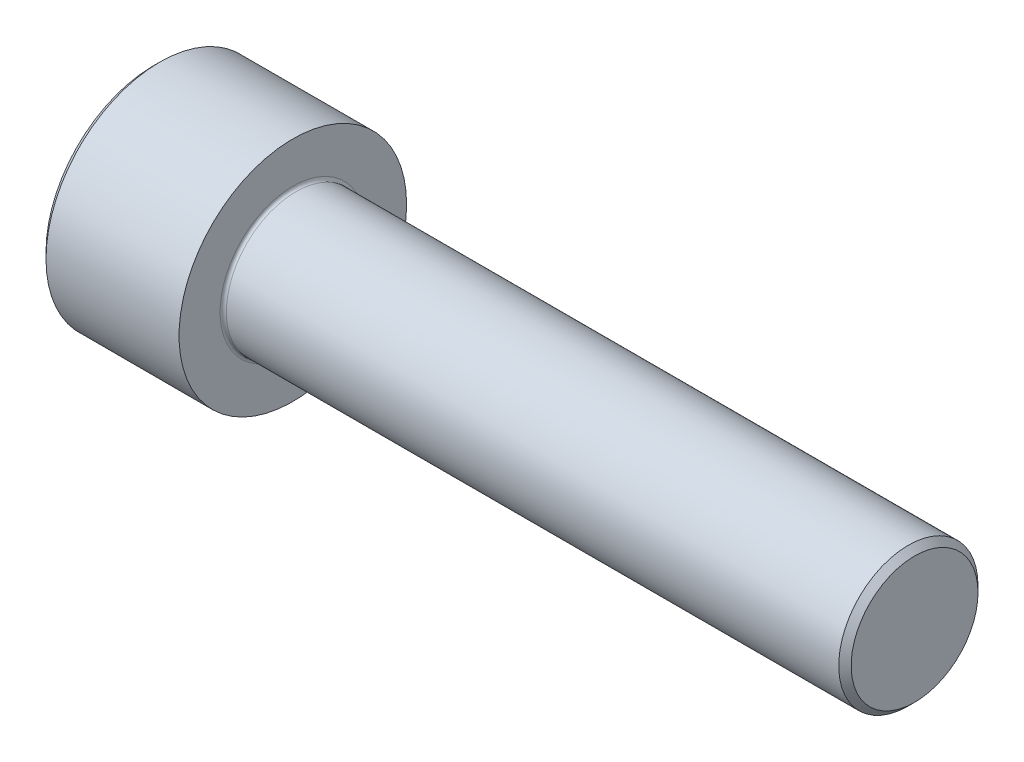
ISO-10303-21;
HEADER;
FILE_DESCRIPTION(('STEP AP214'),'2;1');
FILE_NAME('part.step','',(''),(''),'','','');
FILE_SCHEMA(('AUTOMOTIVE_DESIGN { 1 0 10303 214 1 1 1 1 }'));
ENDSEC;
DATA;
#1=APPLICATION_CONTEXT('core data for automotive mechanical design processes');
#2=APPLICATION_PROTOCOL_DEFINITION('international standard','automotive_design',2000,#1);
#3=PRODUCT_CONTEXT('',#1,'mechanical');
#4=PRODUCT('Part','Part','',(#3));
#5=PRODUCT_RELATED_PRODUCT_CATEGORY('part','',(#4));
#6=PRODUCT_DEFINITION_FORMATION('','',#4);
#7=PRODUCT_DEFINITION_CONTEXT('part definition',#1,'design');
#8=PRODUCT_DEFINITION('design','',#6,#7);
#9=PRODUCT_DEFINITION_SHAPE('','',#8);
#10=(LENGTH_UNIT() NAMED_UNIT(*) SI_UNIT(.MILLI.,.METRE.));
#11=(NAMED_UNIT(*) PLANE_ANGLE_UNIT() SI_UNIT($,.RADIAN.));
#12=(NAMED_UNIT(*) SI_UNIT($,.STERADIAN.) SOLID_ANGLE_UNIT());
#13=UNCERTAINTY_MEASURE_WITH_UNIT(LENGTH_MEASURE(1.E-05),#10,'distance_accuracy_value','');
#14=(GEOMETRIC_REPRESENTATION_CONTEXT(3) GLOBAL_UNCERTAINTY_ASSIGNED_CONTEXT((#13)) GLOBAL_UNIT_ASSIGNED_CONTEXT((#10,
#11,#12)) REPRESENTATION_CONTEXT('',''));
#15=CARTESIAN_POINT('',(0.,0.,0.));
#16=DIRECTION('',(0.,0.,1.));
#17=DIRECTION('',(1.,0.,0.));
#18=AXIS2_PLACEMENT_3D('',#15,#16,#17);
#19=CARTESIAN_POINT('',(0.,0.,0.));
#20=DIRECTION('',(-1.,0.,0.));
#21=DIRECTION('',(0.,0.,1.));
#22=AXIS2_PLACEMENT_3D('',#19,#20,#21);
#23=PLANE('',#22);
#24=CARTESIAN_POINT('',(0.,0.,0.));
#25=DIRECTION('',(-1.,0.,0.));
#26=DIRECTION('',(0.,0.,1.));
#27=AXIS2_PLACEMENT_3D('',#24,#25,#26);
#28=CIRCLE('',#27,2.1971);
#29=CARTESIAN_POINT('',(0.,0.,2.1971));
#30=VERTEX_POINT('',#29);
#31=EDGE_CURVE('E186',#30,#30,#28,.T.);
#32=ORIENTED_EDGE('',*,*,#31,.T.);
#33=EDGE_LOOP('',(#32));
#34=FACE_BOUND('',#33,.T.);
#35=CARTESIAN_POINT('',(0.,0.,0.));
#36=DIRECTION('',(1.,0.,0.));
#37=DIRECTION('',(0.,0.,-1.));
#38=AXIS2_PLACEMENT_3D('',#35,#36,#37);
#39=CIRCLE('',#38,1.3748153285078);
#40=CARTESIAN_POINT('',(0.,1.190625,0.6874076642539));
#41=VERTEX_POINT('',#40);
#42=CARTESIAN_POINT('',(0.,0.,1.3748153285078));
#43=VERTEX_POINT('',#42);
#44=EDGE_CURVE('E105',#41,#43,#39,.T.);
#45=ORIENTED_EDGE('',*,*,#44,.T.);
#46=CARTESIAN_POINT('',(0.,-1.190625,0.687407664253897));
#47=VERTEX_POINT('',#46);
#48=EDGE_CURVE('E133',#43,#47,#39,.T.);
#49=ORIENTED_EDGE('',*,*,#48,.T.);
#50=CARTESIAN_POINT('',(0.,-1.190625,-0.6874076642539));
#51=VERTEX_POINT('',#50);
#52=EDGE_CURVE('E132',#47,#51,#39,.T.);
#53=ORIENTED_EDGE('',*,*,#52,.T.);
#54=CARTESIAN_POINT('',(0.,0.,-1.3748153285078));
#55=VERTEX_POINT('',#54);
#56=EDGE_CURVE('E131',#51,#55,#39,.T.);
#57=ORIENTED_EDGE('',*,*,#56,.T.);
#58=CARTESIAN_POINT('',(0.,1.190625,-0.687407664253898));
#59=VERTEX_POINT('',#58);
#60=EDGE_CURVE('E104',#55,#59,#39,.T.);
#61=ORIENTED_EDGE('',*,*,#60,.T.);
#62=EDGE_CURVE('E97',#59,#41,#39,.T.);
#63=ORIENTED_EDGE('',*,*,#62,.T.);
#64=EDGE_LOOP('',(#45,#49,#53,#57,#61,#63));
#65=FACE_BOUND('',#64,.T.);
#66=ADVANCED_FACE('F37',(#34,#65),#23,.T.);
#67=CARTESIAN_POINT('',(15.5448,0.,0.));
#68=DIRECTION('',(1.,0.,0.));
#69=DIRECTION('',(0.,0.,-1.));
#70=AXIS2_PLACEMENT_3D('',#67,#68,#69);
#71=CYLINDRICAL_SURFACE('',#70,2.3241);
#72=CARTESIAN_POINT('',(0.127000000000004,0.,0.));
#73=DIRECTION('',(-1.,0.,0.));
#74=DIRECTION('',(0.,0.,1.));
#75=AXIS2_PLACEMENT_3D('',#72,#73,#74);
#76=CIRCLE('',#75,2.3241);
#77=CARTESIAN_POINT('',(0.127000000000004,0.,2.3241));
#78=VERTEX_POINT('',#77);
#79=EDGE_CURVE('E183',#78,#78,#76,.F.);
#80=ORIENTED_EDGE('',*,*,#79,.T.);
#81=EDGE_LOOP('',(#80));
#82=FACE_BOUND('',#81,.T.);
#83=CARTESIAN_POINT('',(2.8448,0.,0.));
#84=DIRECTION('',(1.,0.,0.));
#85=DIRECTION('',(0.,0.,-1.));
#86=AXIS2_PLACEMENT_3D('',#83,#84,#85);
#87=CIRCLE('',#86,2.3241);
#88=CARTESIAN_POINT('',(2.8448,0.,-2.3241));
#89=VERTEX_POINT('',#88);
#90=EDGE_CURVE('E174',#89,#89,#87,.T.);
#91=ORIENTED_EDGE('',*,*,#90,.F.);
#92=EDGE_LOOP('',(#91));
#93=FACE_BOUND('',#92,.T.);
#94=ADVANCED_FACE('F221',(#82,#93),#71,.T.);
#95=CARTESIAN_POINT('',(2.8448,0.,-2.3241));
#96=DIRECTION('',(1.,0.,0.));
#97=DIRECTION('',(0.,0.,-1.));
#98=AXIS2_PLACEMENT_3D('',#95,#96,#97);
#99=PLANE('',#98);
#100=CARTESIAN_POINT('',(2.8448,0.,0.));
#101=DIRECTION('',(1.,0.,0.));
#102=DIRECTION('',(0.,0.,-1.));
#103=AXIS2_PLACEMENT_3D('',#100,#101,#102);
#104=CIRCLE('',#103,1.48589999999999);
#105=CARTESIAN_POINT('',(2.8448,0.,-1.48589999999999));
#106=VERTEX_POINT('',#105);
#107=EDGE_CURVE('E51',#106,#106,#104,.F.);
#108=ORIENTED_EDGE('',*,*,#107,.T.);
#109=EDGE_LOOP('',(#108));
#110=FACE_BOUND('',#109,.T.);
#111=ORIENTED_EDGE('',*,*,#90,.T.);
#112=EDGE_LOOP('',(#111));
#113=FACE_BOUND('',#112,.T.);
#114=ADVANCED_FACE('F194',(#110,#113),#99,.T.);
#115=CARTESIAN_POINT('',(15.5448,0.,0.));
#116=DIRECTION('',(1.,0.,0.));
#117=DIRECTION('',(0.,0.,-1.));
#118=AXIS2_PLACEMENT_3D('',#115,#116,#117);
#119=CYLINDRICAL_SURFACE('',#118,1.42239999999999);
#120=CARTESIAN_POINT('',(2.9083,0.,0.));
#121=DIRECTION('',(1.,0.,0.));
#122=DIRECTION('',(0.,0.,-1.));
#123=AXIS2_PLACEMENT_3D('',#120,#121,#122);
#124=CIRCLE('',#123,1.42239999999999);
#125=CARTESIAN_POINT('',(2.9083,0.,-1.42239999999999));
#126=VERTEX_POINT('',#125);
#127=EDGE_CURVE('E189',#126,#126,#124,.T.);
#128=ORIENTED_EDGE('',*,*,#127,.T.);
#129=EDGE_LOOP('',(#128));
#130=FACE_BOUND('',#129,.T.);
#131=CARTESIAN_POINT('',(15.4178,0.,0.));
#132=DIRECTION('',(1.,0.,0.));
#133=DIRECTION('',(0.,0.,-1.));
#134=AXIS2_PLACEMENT_3D('',#131,#132,#133);
#135=CIRCLE('',#134,1.42239999999999);
#136=CARTESIAN_POINT('',(15.4178,0.,-1.42239999999999));
#137=VERTEX_POINT('',#136);
#138=EDGE_CURVE('E180',#137,#137,#135,.F.);
#139=ORIENTED_EDGE('',*,*,#138,.T.);
#140=EDGE_LOOP('',(#139));
#141=FACE_BOUND('',#140,.T.);
#142=ADVANCED_FACE('F202',(#130,#141),#119,.T.);
#143=CARTESIAN_POINT('',(15.5448,0.,-1.42239999999999));
#144=DIRECTION('',(1.,0.,0.));
#145=DIRECTION('',(0.,0.,-1.));
#146=AXIS2_PLACEMENT_3D('',#143,#144,#145);
#147=PLANE('',#146);
#148=CARTESIAN_POINT('',(15.5448,0.,0.));
#149=DIRECTION('',(1.,0.,0.));
#150=DIRECTION('',(0.,0.,-1.));
#151=AXIS2_PLACEMENT_3D('',#148,#149,#150);
#152=CIRCLE('',#151,1.29539999999999);
#153=CARTESIAN_POINT('',(15.5448,0.,-1.29539999999999));
#154=VERTEX_POINT('',#153);
#155=EDGE_CURVE('E177',#154,#154,#152,.T.);
#156=ORIENTED_EDGE('',*,*,#155,.T.);
#157=EDGE_LOOP('',(#156));
#158=FACE_BOUND('',#157,.T.);
#159=ADVANCED_FACE('F205',(#158),#147,.T.);
#160=CARTESIAN_POINT('',(15.5448,0.,0.));
#161=DIRECTION('',(-1.,0.,0.));
#162=DIRECTION('',(0.,0.,1.));
#163=AXIS2_PLACEMENT_3D('',#160,#161,#162);
#164=CONICAL_SURFACE('',#163,1.29539999999999,0.785398163397441);
#165=ORIENTED_EDGE('',*,*,#138,.F.);
#166=EDGE_LOOP('',(#165));
#167=FACE_BOUND('',#166,.T.);
#168=ORIENTED_EDGE('',*,*,#155,.F.);
#169=EDGE_LOOP('',(#168));
#170=FACE_BOUND('',#169,.T.);
#171=ADVANCED_FACE('F209',(#167,#170),#164,.T.);
#172=CARTESIAN_POINT('',(0.127000000000004,0.,0.));
#173=DIRECTION('',(1.,0.,0.));
#174=DIRECTION('',(0.,0.,-1.));
#175=AXIS2_PLACEMENT_3D('',#172,#173,#174);
#176=CONICAL_SURFACE('',#175,2.3241,0.785398163397445);
#177=ORIENTED_EDGE('',*,*,#31,.F.);
#178=EDGE_LOOP('',(#177));
#179=FACE_BOUND('',#178,.T.);
#180=ORIENTED_EDGE('',*,*,#79,.F.);
#181=EDGE_LOOP('',(#180));
#182=FACE_BOUND('',#181,.T.);
#183=ADVANCED_FACE('F199',(#179,#182),#176,.T.);
#184=CARTESIAN_POINT('',(2.9083,0.,0.));
#185=DIRECTION('',(1.,0.,0.));
#186=DIRECTION('',(0.,0.,-1.));
#187=AXIS2_PLACEMENT_3D('',#184,#185,#186);
#188=TOROIDAL_SURFACE('',#187,1.48589999999999,0.0635);
#189=ORIENTED_EDGE('',*,*,#107,.F.);
#190=EDGE_LOOP('',(#189));
#191=FACE_BOUND('',#190,.T.);
#192=ORIENTED_EDGE('',*,*,#127,.F.);
#193=EDGE_LOOP('',(#192));
#194=FACE_BOUND('',#193,.T.);
#195=ADVANCED_FACE('F39',(#191,#194),#188,.F.);
#196=CARTESIAN_POINT('',(0.,0.,0.));
#197=DIRECTION('',(-1.,0.,0.));
#198=DIRECTION('',(0.,0.,-1.));
#199=AXIS2_PLACEMENT_3D('',#196,#197,#198);
#200=CONICAL_SURFACE('',#199,1.3748153285078,0.78539816339745);
#201=CARTESIAN_POINT('',(-0.000115484600023828,-0.000199999999999818,-1.37493079856163));
#202=CARTESIAN_POINT('',(0.0235012357857367,0.0407344195898565,-1.35129730039231));
#203=CARTESIAN_POINT('',(0.0457312182768793,0.082353388301974,-1.32726857760297));
#204=CARTESIAN_POINT('',(0.086434337372563,0.167219443673632,-1.27827113768909));
#205=CARTESIAN_POINT('',(0.104884817352449,0.210474607290961,-1.25329775733078));
#206=CARTESIAN_POINT('',(0.136491161995679,0.297696647457424,-1.2029400889614));
#207=CARTESIAN_POINT('',(0.149726495756684,0.341641294957925,-1.17756863489755));
#208=CARTESIAN_POINT('',(0.170118548424605,0.430498374163694,-1.12626697629869));
#209=CARTESIAN_POINT('',(0.177290497104008,0.475408088834755,-1.10033834044413));
#210=CARTESIAN_POINT('',(0.183761461351144,0.552804127656978,-1.0556537165959));
#211=CARTESIAN_POINT('',(0.18471967985321,0.585190412515646,-1.0369554863147));
#212=CARTESIAN_POINT('',(0.183107350927916,0.64990607331777,-0.99959188212981));
#213=CARTESIAN_POINT('',(0.180536024820421,0.682235435127272,-0.980926516386364));
#214=CARTESIAN_POINT('',(0.172013246006379,0.746582156071485,-0.943775919727754));
#215=CARTESIAN_POINT('',(0.166058645247436,0.778599196336768,-0.925290872911937));
#216=CARTESIAN_POINT('',(0.1510900359288,0.842098763396457,-0.888629380776601));
#217=CARTESIAN_POINT('',(0.142074714087946,0.873581054644164,-0.870453071450031));
#218=CARTESIAN_POINT('',(0.115317704161984,0.954214838572127,-0.823899134593444));
#219=CARTESIAN_POINT('',(0.0955631855639919,1.00285783526766,-0.795815087357089));
#220=CARTESIAN_POINT('',(0.05106323104232,1.09823941635212,-0.740746505842243));
#221=CARTESIAN_POINT('',(0.0263340352838413,1.14498361758716,-0.713758728676141));
#222=CARTESIAN_POINT('',(-0.00011548460002395,1.190825,-0.68729219420006));
#223=B_SPLINE_CURVE_WITH_KNOTS('',3,(#201,#202,#203,#204,#205,#206,#207,#208,#209,#210,#211,
#212,#213,#214,#215,#216,#217,#218,#219,#220,#221,#222),.UNSPECIFIED.,.F.,.F.,(4,2,2,2,2,2,2,2,
2,2,4),(0.,0.15862567293412,0.318176079843271,0.475191357500655,0.631811068630748,
0.743878551794718,0.855970763007029,0.968167444423241,1.08041232768377,1.25873351645467,
1.43648174479847),.UNSPECIFIED.);
#224=EDGE_CURVE('E11',#55,#59,#223,.T.);
#225=ORIENTED_EDGE('',*,*,#224,.T.);
#226=ORIENTED_EDGE('',*,*,#60,.F.);
#227=EDGE_LOOP('',(#225,#226));
#228=FACE_BOUND('',#227,.T.);
#229=ADVANCED_FACE('F109',(#228),#200,.F.);
#230=CARTESIAN_POINT('',(-0.440990447440544,1.190625,-1.3709714531464));
#231=CARTESIAN_POINT('',(-0.415789988952629,1.190625,-1.33758920657277));
#232=CARTESIAN_POINT('',(-0.390836620376461,1.190625,-1.30402095515484));
#233=CARTESIAN_POINT('',(-0.341526087304665,1.190625,-1.23643692315458));
#234=CARTESIAN_POINT('',(-0.317169074021073,1.190625,-1.20242103236242));
#235=CARTESIAN_POINT('',(-0.244798209093533,1.190625,-1.09909081497949));
#236=CARTESIAN_POINT('',(-0.197872622688341,1.190625,-1.02900143520981));
#237=CARTESIAN_POINT('',(-0.105752103394674,1.190625,-0.88202673754063));
#238=CARTESIAN_POINT('',(-0.0608088372989925,1.190625,-0.804981866122375));
#239=CARTESIAN_POINT('',(0.0214019754586501,1.190625,-0.647043893381155));
#240=CARTESIAN_POINT('',(0.0586953982437518,1.190625,-0.566164943760923));
#241=CARTESIAN_POINT('',(0.104320444420462,1.190625,-0.444764933915431));
#242=CARTESIAN_POINT('',(0.117415160961775,1.190625,-0.406041211538074));
#243=CARTESIAN_POINT('',(0.140495724086988,1.190625,-0.327658904773021));
#244=CARTESIAN_POINT('',(0.15048135649834,1.190625,-0.288000256184282));
#245=CARTESIAN_POINT('',(0.166658770921502,1.190625,-0.208647693287848));
#246=CARTESIAN_POINT('',(0.172915554139537,1.190625,-0.168967240702489));
#247=CARTESIAN_POINT('',(0.1815131115746,1.190625,-0.0891819743864546));
#248=CARTESIAN_POINT('',(0.183854558946057,1.190625,-0.0490772347958505));
#249=CARTESIAN_POINT('',(0.184447755934785,1.190625,0.0297075772901229));
#250=CARTESIAN_POINT('',(0.182844646209979,1.190625,0.0683866067218445));
#251=CARTESIAN_POINT('',(0.175956972269256,1.190625,0.145416876518751));
#252=CARTESIAN_POINT('',(0.170671702349433,1.190625,0.183768052622755));
#253=CARTESIAN_POINT('',(0.156618587793748,1.190625,0.260508634780065));
#254=CARTESIAN_POINT('',(0.147791637425379,1.190625,0.298887051910833));
#255=CARTESIAN_POINT('',(0.127124290059815,1.190625,0.374805334115854));
#256=CARTESIAN_POINT('',(0.115284145209174,1.190625,0.412345269069195));
#257=CARTESIAN_POINT('',(0.0735526663999553,1.190625,0.530535580740913));
#258=CARTESIAN_POINT('',(0.0389086031730756,1.190625,0.609503725551087));
#259=CARTESIAN_POINT('',(-0.038118251844658,1.190625,0.763730268871194));
#260=CARTESIAN_POINT('',(-0.0805288465159366,1.190625,0.838974064408866));
#261=CARTESIAN_POINT('',(-0.168025644829118,1.190625,0.982775795881686));
#262=CARTESIAN_POINT('',(-0.212874161838995,1.190625,1.05148016574363));
#263=CARTESIAN_POINT('',(-0.282205329675895,1.190625,1.15270222220782));
#264=CARTESIAN_POINT('',(-0.305560176080382,1.190625,1.18600604109445));
#265=CARTESIAN_POINT('',(-0.352887568742372,1.190625,1.25215860324015));
#266=CARTESIAN_POINT('',(-0.376859944571277,1.190625,1.28500746829151));
#267=CARTESIAN_POINT('',(-0.401088366474195,1.190625,1.31766689387937));
#268=B_SPLINE_CURVE_WITH_KNOTS('',3,(#230,#231,#232,#233,#234,#235,#236,#237,#238,#239,#240,
#241,#242,#243,#244,#245,#246,#247,#248,#249,#250,#251,#252,#253,#254,#255,#256,#257,#258,#259,
#260,#261,#262,#263,#264,#265,#266,#267),.UNSPECIFIED.,.F.,.F.,(4,2,2,2,2,2,2,2,2,2,2,2,2,2,2,2,
2,2,4),(0.,0.125475644787213,0.25098278246174,0.50391251886562,0.771279184794252,
1.03772598276166,1.16025581663755,1.28279408924409,1.40312855519665,1.52344233020124,
1.63939577678759,1.75537145253145,1.87336894106199,1.99135655871207,2.24929724984114,
2.50818004702777,2.75419821455323,2.87622362097735,2.99821570364111),.UNSPECIFIED.);
#269=EDGE_CURVE('E100',#59,#41,#268,.T.);
#270=ORIENTED_EDGE('',*,*,#269,.T.);
#271=ORIENTED_EDGE('',*,*,#62,.F.);
#272=EDGE_LOOP('',(#270,#271));
#273=FACE_BOUND('',#272,.T.);
#274=ADVANCED_FACE('F98',(#273),#200,.F.);
#275=CARTESIAN_POINT('',(-0.000115484600023922,1.190825,0.687292194200061));
#276=CARTESIAN_POINT('',(0.0235012357857367,1.14989058041014,0.710925692369386));
#277=CARTESIAN_POINT('',(0.0457312182768794,1.10827161169803,0.734954415158721));
#278=CARTESIAN_POINT('',(0.0864343373725631,1.02340555632637,0.78395185507261));
#279=CARTESIAN_POINT('',(0.104884817352449,0.980150392709039,0.808925235430916));
#280=CARTESIAN_POINT('',(0.136491161995679,0.892928352542576,0.859282903800292));
#281=CARTESIAN_POINT('',(0.149726495756684,0.848983705042075,0.884654357864149));
#282=CARTESIAN_POINT('',(0.170118548424605,0.760126625836306,0.935956016463004));
#283=CARTESIAN_POINT('',(0.177290497104008,0.715216911165245,0.96188465231757));
#284=CARTESIAN_POINT('',(0.183761461351144,0.637820872343022,1.00656927616579));
#285=CARTESIAN_POINT('',(0.18471967985321,0.605434587484353,1.025267506447));
#286=CARTESIAN_POINT('',(0.183107350927916,0.54071892668223,1.06263111063189));
#287=CARTESIAN_POINT('',(0.180536024820421,0.508389564872727,1.08129647637533));
#288=CARTESIAN_POINT('',(0.172013246006379,0.444042843928515,1.11844707303394));
#289=CARTESIAN_POINT('',(0.166058645247436,0.412025803663232,1.13693211984976));
#290=CARTESIAN_POINT('',(0.1510900359288,0.348526236603542,1.17359361198509));
#291=CARTESIAN_POINT('',(0.142074714087946,0.317043945355835,1.19176992131166));
#292=CARTESIAN_POINT('',(0.115317704161983,0.236410161427873,1.23832385816825));
#293=CARTESIAN_POINT('',(0.0955631855639916,0.187767164732342,1.26640790540461));
#294=CARTESIAN_POINT('',(0.0510632310423199,0.0923855836478814,1.32147648691945));
#295=CARTESIAN_POINT('',(0.0263340352838413,0.0456413824128449,1.34846426408555));
#296=CARTESIAN_POINT('',(-0.000115484600023925,-0.000199999999999566,1.37493079856163));
#297=B_SPLINE_CURVE_WITH_KNOTS('',3,(#275,#276,#277,#278,#279,#280,#281,#282,#283,#284,#285,
#286,#287,#288,#289,#290,#291,#292,#293,#294,#295,#296),.UNSPECIFIED.,.F.,.F.,(4,2,2,2,2,2,2,2,
2,2,4),(0.,0.15862567293412,0.318176079843271,0.475191357500655,0.631811068630748,
0.743878551794718,0.855970763007029,0.968167444423242,1.08041232768377,1.25873351645467,
1.43648174479847),.UNSPECIFIED.);
#298=EDGE_CURVE('E122',#41,#43,#297,.T.);
#299=ORIENTED_EDGE('',*,*,#298,.T.);
#300=ORIENTED_EDGE('',*,*,#44,.F.);
#301=EDGE_LOOP('',(#299,#300));
#302=FACE_BOUND('',#301,.T.);
#303=ADVANCED_FACE('F138',(#302),#200,.F.);
#304=CARTESIAN_POINT('',(-0.000115484600023705,0.000200000000000502,1.37493079856163));
#305=CARTESIAN_POINT('',(0.0235012357857369,-0.0407344195898558,1.35129730039231));
#306=CARTESIAN_POINT('',(0.0457312182768796,-0.0823533883019733,1.32726857760297));
#307=CARTESIAN_POINT('',(0.0864343373725634,-0.167219443673632,1.27827113768908));
#308=CARTESIAN_POINT('',(0.104884817352449,-0.21047460729096,1.25329775733078));
#309=CARTESIAN_POINT('',(0.13649116199568,-0.297696647457424,1.2029400889614));
#310=CARTESIAN_POINT('',(0.149726495756684,-0.341641294957925,1.17756863489755));
#311=CARTESIAN_POINT('',(0.170118548424606,-0.430498374163693,1.12626697629869));
#312=CARTESIAN_POINT('',(0.177290497104008,-0.475408088834755,1.10033834044412));
#313=CARTESIAN_POINT('',(0.183761461351144,-0.552804127656978,1.0556537165959));
#314=CARTESIAN_POINT('',(0.184719679853211,-0.585190412515646,1.0369554863147));
#315=CARTESIAN_POINT('',(0.183107350927916,-0.64990607331777,0.999591882129809));
#316=CARTESIAN_POINT('',(0.180536024820421,-0.682235435127272,0.980926516386364));
#317=CARTESIAN_POINT('',(0.172013246006379,-0.746582156071484,0.943775919727753));
#318=CARTESIAN_POINT('',(0.166058645247436,-0.778599196336768,0.925290872911937));
#319=CARTESIAN_POINT('',(0.1510900359288,-0.842098763396457,0.888629380776601));
#320=CARTESIAN_POINT('',(0.142074714087946,-0.873581054644164,0.870453071450031));
#321=CARTESIAN_POINT('',(0.115317704161984,-0.954214838572126,0.823899134593444));
#322=CARTESIAN_POINT('',(0.0955631855639924,-1.00285783526766,0.795815087357089));
#323=CARTESIAN_POINT('',(0.0510632310423206,-1.09823941635212,0.740746505842243));
#324=CARTESIAN_POINT('',(0.0263340352838419,-1.14498361758716,0.713758728676141));
#325=CARTESIAN_POINT('',(-0.000115484600023264,-1.190825,0.68729219420006));
#326=B_SPLINE_CURVE_WITH_KNOTS('',3,(#304,#305,#306,#307,#308,#309,#310,#311,#312,#313,#314,
#315,#316,#317,#318,#319,#320,#321,#322,#323,#324,#325),.UNSPECIFIED.,.F.,.F.,(4,2,2,2,2,2,2,2,
2,2,4),(0.,0.158625672934121,0.318176079843271,0.475191357500656,0.631811068630749,
0.743878551794718,0.855970763007029,0.968167444423242,1.08041232768377,1.25873351645467,
1.43648174479847),.UNSPECIFIED.);
#327=EDGE_CURVE('E139',#43,#47,#326,.T.);
#328=ORIENTED_EDGE('',*,*,#327,.T.);
#329=ORIENTED_EDGE('',*,*,#48,.F.);
#330=EDGE_LOOP('',(#328,#329));
#331=FACE_BOUND('',#330,.T.);
#332=ADVANCED_FACE('F143',(#331),#200,.F.);
#333=CARTESIAN_POINT('',(-0.440990447440545,-1.190625,-1.37097145314641));
#334=CARTESIAN_POINT('',(-0.41578998895263,-1.190625,-1.33758920657277));
#335=CARTESIAN_POINT('',(-0.390836620376462,-1.190625,-1.30402095515484));
#336=CARTESIAN_POINT('',(-0.341526087304666,-1.190625,-1.23643692315459));
#337=CARTESIAN_POINT('',(-0.317169074021074,-1.190625,-1.20242103236242));
#338=CARTESIAN_POINT('',(-0.244798209093534,-1.190625,-1.09909081497949));
#339=CARTESIAN_POINT('',(-0.197872622688342,-1.190625,-1.02900143520981));
#340=CARTESIAN_POINT('',(-0.105752103394675,-1.190625,-0.882026737540632));
#341=CARTESIAN_POINT('',(-0.060808837298993,-1.190625,-0.804981866122377));
#342=CARTESIAN_POINT('',(0.0214019754586498,-1.190625,-0.647043893381156));
#343=CARTESIAN_POINT('',(0.0586953982437515,-1.190625,-0.566164943760924));
#344=CARTESIAN_POINT('',(0.104320444420462,-1.190625,-0.444764933915432));
#345=CARTESIAN_POINT('',(0.117415160961775,-1.190625,-0.406041211538075));
#346=CARTESIAN_POINT('',(0.140495724086988,-1.190625,-0.327658904773022));
#347=CARTESIAN_POINT('',(0.15048135649834,-1.190625,-0.288000256184283));
#348=CARTESIAN_POINT('',(0.166658770921503,-1.190625,-0.208647693287849));
#349=CARTESIAN_POINT('',(0.172915554139537,-1.190625,-0.16896724070249));
#350=CARTESIAN_POINT('',(0.1815131115746,-1.190625,-0.0891819743864549));
#351=CARTESIAN_POINT('',(0.183854558946058,-1.190625,-0.0490772347958508));
#352=CARTESIAN_POINT('',(0.184447755934786,-1.190625,0.0297075772901227));
#353=CARTESIAN_POINT('',(0.18284464620998,-1.190625,0.0683866067218443));
#354=CARTESIAN_POINT('',(0.175956972269256,-1.190625,0.145416876518751));
#355=CARTESIAN_POINT('',(0.170671702349433,-1.190625,0.183768052622755));
#356=CARTESIAN_POINT('',(0.156618587793748,-1.190625,0.260508634780065));
#357=CARTESIAN_POINT('',(0.14779163742538,-1.190625,0.298887051910833));
#358=CARTESIAN_POINT('',(0.127124290059816,-1.190625,0.374805334115854));
#359=CARTESIAN_POINT('',(0.115284145209174,-1.190625,0.412345269069194));
#360=CARTESIAN_POINT('',(0.0735526663999555,-1.190625,0.530535580740913));
#361=CARTESIAN_POINT('',(0.0389086031730758,-1.190625,0.609503725551088));
#362=CARTESIAN_POINT('',(-0.0381182518446578,-1.190625,0.763730268871194));
#363=CARTESIAN_POINT('',(-0.0805288465159364,-1.190625,0.838974064408866));
#364=CARTESIAN_POINT('',(-0.168025644829118,-1.190625,0.982775795881686));
#365=CARTESIAN_POINT('',(-0.212874161838995,-1.190625,1.05148016574363));
#366=CARTESIAN_POINT('',(-0.282205329675895,-1.190625,1.15270222220782));
#367=CARTESIAN_POINT('',(-0.305560176080382,-1.190625,1.18600604109445));
#368=CARTESIAN_POINT('',(-0.352887568742372,-1.190625,1.25215860324015));
#369=CARTESIAN_POINT('',(-0.376859944571277,-1.190625,1.28500746829151));
#370=CARTESIAN_POINT('',(-0.401088366474196,-1.190625,1.31766689387937));
#371=B_SPLINE_CURVE_WITH_KNOTS('',3,(#333,#334,#335,#336,#337,#338,#339,#340,#341,#342,#343,
#344,#345,#346,#347,#348,#349,#350,#351,#352,#353,#354,#355,#356,#357,#358,#359,#360,#361,#362,
#363,#364,#365,#366,#367,#368,#369,#370),.UNSPECIFIED.,.F.,.F.,(4,2,2,2,2,2,2,2,2,2,2,2,2,2,2,2,
2,2,4),(0.,0.125475644787213,0.25098278246174,0.50391251886562,0.771279184794253,
1.03772598276166,1.16025581663755,1.28279408924409,1.40312855519666,1.52344233020124,
1.63939577678759,1.75537145253145,1.87336894106199,1.99135655871207,2.24929724984114,
2.50818004702777,2.75419821455323,2.87622362097735,2.99821570364112),.UNSPECIFIED.);
#372=EDGE_CURVE('E147',#47,#51,#371,.F.);
#373=ORIENTED_EDGE('',*,*,#372,.T.);
#374=ORIENTED_EDGE('',*,*,#52,.F.);
#375=EDGE_LOOP('',(#373,#374));
#376=FACE_BOUND('',#375,.T.);
#377=ADVANCED_FACE('F254',(#376),#200,.F.);
#378=CARTESIAN_POINT('',(-0.000115484600023922,-1.190825,-0.687292194200061));
#379=CARTESIAN_POINT('',(0.0235012357857367,-1.14989058041014,-0.710925692369386));
#380=CARTESIAN_POINT('',(0.0457312182768793,-1.10827161169803,-0.734954415158721));
#381=CARTESIAN_POINT('',(0.086434337372563,-1.02340555632637,-0.78395185507261));
#382=CARTESIAN_POINT('',(0.104884817352448,-0.980150392709039,-0.808925235430916));
#383=CARTESIAN_POINT('',(0.136491161995679,-0.892928352542576,-0.859282903800292));
#384=CARTESIAN_POINT('',(0.149726495756684,-0.848983705042075,-0.884654357864149));
#385=CARTESIAN_POINT('',(0.170118548424605,-0.760126625836306,-0.935956016463003));
#386=CARTESIAN_POINT('',(0.177290497104007,-0.715216911165245,-0.96188465231757));
#387=CARTESIAN_POINT('',(0.183761461351144,-0.637820872343022,-1.00656927616579));
#388=CARTESIAN_POINT('',(0.18471967985321,-0.605434587484353,-1.025267506447));
#389=CARTESIAN_POINT('',(0.183107350927916,-0.54071892668223,-1.06263111063189));
#390=CARTESIAN_POINT('',(0.180536024820421,-0.508389564872727,-1.08129647637533));
#391=CARTESIAN_POINT('',(0.172013246006379,-0.444042843928515,-1.11844707303394));
#392=CARTESIAN_POINT('',(0.166058645247436,-0.412025803663232,-1.13693211984976));
#393=CARTESIAN_POINT('',(0.1510900359288,-0.348526236603543,-1.17359361198509));
#394=CARTESIAN_POINT('',(0.142074714087946,-0.317043945355835,-1.19176992131166));
#395=CARTESIAN_POINT('',(0.115317704161983,-0.236410161427873,-1.23832385816825));
#396=CARTESIAN_POINT('',(0.0955631855639917,-0.187767164732342,-1.26640790540461));
#397=CARTESIAN_POINT('',(0.05106323104232,-0.092385583647881,-1.32147648691945));
#398=CARTESIAN_POINT('',(0.0263340352838414,-0.0456413824128445,-1.34846426408555));
#399=CARTESIAN_POINT('',(-0.000115484600023955,0.000200000000000065,-1.37493079856163));
#400=B_SPLINE_CURVE_WITH_KNOTS('',3,(#378,#379,#380,#381,#382,#383,#384,#385,#386,#387,#388,
#389,#390,#391,#392,#393,#394,#395,#396,#397,#398,#399),.UNSPECIFIED.,.F.,.F.,(4,2,2,2,2,2,2,2,
2,2,4),(0.,0.15862567293412,0.318176079843271,0.475191357500655,0.631811068630748,
0.743878551794718,0.855970763007029,0.968167444423242,1.08041232768377,1.25873351645467,
1.43648174479847),.UNSPECIFIED.);
#401=EDGE_CURVE('E57',#51,#55,#400,.T.);
#402=ORIENTED_EDGE('',*,*,#401,.T.);
#403=ORIENTED_EDGE('',*,*,#56,.F.);
#404=EDGE_LOOP('',(#402,#403));
#405=FACE_BOUND('',#404,.T.);
#406=ADVANCED_FACE('F232',(#405),#200,.F.);
#407=CARTESIAN_POINT('',(1.89653333333333,0.,0.));
#408=DIRECTION('',(1.,0.,0.));
#409=DIRECTION('',(0.,0.,-1.));
#410=AXIS2_PLACEMENT_3D('',#407,#408,#409);
#411=PLANE('',#410);
#412=DIRECTION('',(0.,-0.866025403784439,-0.5));
#413=VECTOR('',#412,1.);
#414=CARTESIAN_POINT('',(1.89653333333333,1.190625,-0.687407664253898));
#415=LINE('',#414,#413);
#416=CARTESIAN_POINT('',(1.89653333333333,1.190625,-0.687407664253898));
#417=VERTEX_POINT('',#416);
#418=CARTESIAN_POINT('',(1.89653333333333,0.,-1.3748153285078));
#419=VERTEX_POINT('',#418);
#420=EDGE_CURVE('E126',#417,#419,#415,.T.);
#421=ORIENTED_EDGE('',*,*,#420,.T.);
#422=DIRECTION('',(0.,-0.866025403784439,0.5));
#423=VECTOR('',#422,1.);
#424=CARTESIAN_POINT('',(1.89653333333333,0.,-1.3748153285078));
#425=LINE('',#424,#423);
#426=CARTESIAN_POINT('',(1.89653333333333,-1.190625,-0.687407664253899));
#427=VERTEX_POINT('',#426);
#428=EDGE_CURVE('E171',#419,#427,#425,.T.);
#429=ORIENTED_EDGE('',*,*,#428,.T.);
#430=DIRECTION('',(0.,0.,1.));
#431=VECTOR('',#430,1.);
#432=CARTESIAN_POINT('',(1.89653333333333,-1.190625,-0.687407664253899));
#433=LINE('',#432,#431);
#434=CARTESIAN_POINT('',(1.89653333333333,-1.190625,0.687407664253899));
#435=VERTEX_POINT('',#434);
#436=EDGE_CURVE('E163',#427,#435,#433,.T.);
#437=ORIENTED_EDGE('',*,*,#436,.T.);
#438=DIRECTION('',(0.,0.866025403784439,0.5));
#439=VECTOR('',#438,1.);
#440=CARTESIAN_POINT('',(1.89653333333333,-1.190625,0.687407664253898));
#441=LINE('',#440,#439);
#442=CARTESIAN_POINT('',(1.89653333333333,0.,1.3748153285078));
#443=VERTEX_POINT('',#442);
#444=EDGE_CURVE('E162',#435,#443,#441,.T.);
#445=ORIENTED_EDGE('',*,*,#444,.T.);
#446=DIRECTION('',(0.,0.866025403784439,-0.5));
#447=VECTOR('',#446,1.);
#448=CARTESIAN_POINT('',(1.89653333333333,0.,1.3748153285078));
#449=LINE('',#448,#447);
#450=CARTESIAN_POINT('',(1.89653333333333,1.190625,0.687407664253899));
#451=VERTEX_POINT('',#450);
#452=EDGE_CURVE('E437',#443,#451,#449,.T.);
#453=ORIENTED_EDGE('',*,*,#452,.T.);
#454=DIRECTION('',(0.,0.,-1.));
#455=VECTOR('',#454,1.);
#456=CARTESIAN_POINT('',(1.89653333333333,1.190625,0.687407664253899));
#457=LINE('',#456,#455);
#458=EDGE_CURVE('E127',#451,#417,#457,.T.);
#459=ORIENTED_EDGE('',*,*,#458,.T.);
#460=EDGE_LOOP('',(#421,#429,#437,#445,#453,#459));
#461=FACE_BOUND('',#460,.T.);
#462=ADVANCED_FACE('F229',(#461),#411,.F.);
#463=CARTESIAN_POINT('',(5.53395279120453,1.190625,-0.687407664253898));
#464=DIRECTION('',(0.,0.5,-0.866025403784439));
#465=DIRECTION('',(0.,0.866025403784439,0.5));
#466=AXIS2_PLACEMENT_3D('',#463,#464,#465);
#467=PLANE('',#466);
#468=ORIENTED_EDGE('',*,*,#224,.F.);
#469=DIRECTION('',(-1.,0.,0.));
#470=VECTOR('',#469,1.);
#471=CARTESIAN_POINT('',(5.53395279120453,0.,-1.3748153285078));
#472=LINE('',#471,#470);
#473=EDGE_CURVE('E172',#419,#55,#472,.T.);
#474=ORIENTED_EDGE('',*,*,#473,.F.);
#475=ORIENTED_EDGE('',*,*,#420,.F.);
#476=DIRECTION('',(-1.,0.,0.));
#477=VECTOR('',#476,1.);
#478=CARTESIAN_POINT('',(5.53395279120453,1.190625,-0.687407664253898));
#479=LINE('',#478,#477);
#480=EDGE_CURVE('E118',#417,#59,#479,.T.);
#481=ORIENTED_EDGE('',*,*,#480,.T.);
#482=EDGE_LOOP('',(#468,#474,#475,#481));
#483=FACE_BOUND('',#482,.T.);
#484=ADVANCED_FACE('F124',(#483),#467,.F.);
#485=CARTESIAN_POINT('',(5.53395279120453,1.190625,0.687407664253899));
#486=DIRECTION('',(0.,1.,0.));
#487=DIRECTION('',(0.,0.,1.));
#488=AXIS2_PLACEMENT_3D('',#485,#486,#487);
#489=PLANE('',#488);
#490=ORIENTED_EDGE('',*,*,#269,.F.);
#491=ORIENTED_EDGE('',*,*,#480,.F.);
#492=ORIENTED_EDGE('',*,*,#458,.F.);
#493=DIRECTION('',(-1.,0.,0.));
#494=VECTOR('',#493,1.);
#495=CARTESIAN_POINT('',(5.53395279120453,1.190625,0.687407664253899));
#496=LINE('',#495,#494);
#497=EDGE_CURVE('E121',#451,#41,#496,.T.);
#498=ORIENTED_EDGE('',*,*,#497,.T.);
#499=EDGE_LOOP('',(#490,#491,#492,#498));
#500=FACE_BOUND('',#499,.T.);
#501=ADVANCED_FACE('F117',(#500),#489,.F.);
#502=CARTESIAN_POINT('',(5.53395279120453,0.,1.3748153285078));
#503=DIRECTION('',(0.,0.5,0.866025403784439));
#504=DIRECTION('',(0.,-0.866025403784439,0.5));
#505=AXIS2_PLACEMENT_3D('',#502,#503,#504);
#506=PLANE('',#505);
#507=ORIENTED_EDGE('',*,*,#298,.F.);
#508=ORIENTED_EDGE('',*,*,#497,.F.);
#509=ORIENTED_EDGE('',*,*,#452,.F.);
#510=DIRECTION('',(-1.,0.,0.));
#511=VECTOR('',#510,1.);
#512=CARTESIAN_POINT('',(5.53395279120453,0.,1.3748153285078));
#513=LINE('',#512,#511);
#514=EDGE_CURVE('E65',#443,#43,#513,.T.);
#515=ORIENTED_EDGE('',*,*,#514,.T.);
#516=EDGE_LOOP('',(#507,#508,#509,#515));
#517=FACE_BOUND('',#516,.T.);
#518=ADVANCED_FACE('F277',(#517),#506,.F.);
#519=CARTESIAN_POINT('',(5.53395279120453,-1.190625,0.687407664253898));
#520=DIRECTION('',(0.,-0.5,0.866025403784439));
#521=DIRECTION('',(0.,-0.866025403784439,-0.5));
#522=AXIS2_PLACEMENT_3D('',#519,#520,#521);
#523=PLANE('',#522);
#524=ORIENTED_EDGE('',*,*,#327,.F.);
#525=ORIENTED_EDGE('',*,*,#514,.F.);
#526=ORIENTED_EDGE('',*,*,#444,.F.);
#527=DIRECTION('',(-1.,0.,0.));
#528=VECTOR('',#527,1.);
#529=CARTESIAN_POINT('',(5.53395279120453,-1.190625,0.687407664253898));
#530=LINE('',#529,#528);
#531=EDGE_CURVE('E154',#435,#47,#530,.T.);
#532=ORIENTED_EDGE('',*,*,#531,.T.);
#533=EDGE_LOOP('',(#524,#525,#526,#532));
#534=FACE_BOUND('',#533,.T.);
#535=ADVANCED_FACE('F160',(#534),#523,.F.);
#536=CARTESIAN_POINT('',(5.53395279120453,-1.190625,-0.687407664253899));
#537=DIRECTION('',(0.,-1.,0.));
#538=DIRECTION('',(0.,0.,-1.));
#539=AXIS2_PLACEMENT_3D('',#536,#537,#538);
#540=PLANE('',#539);
#541=ORIENTED_EDGE('',*,*,#372,.F.);
#542=ORIENTED_EDGE('',*,*,#531,.F.);
#543=ORIENTED_EDGE('',*,*,#436,.F.);
#544=DIRECTION('',(-1.,0.,0.));
#545=VECTOR('',#544,1.);
#546=CARTESIAN_POINT('',(5.53395279120453,-1.190625,-0.687407664253899));
#547=LINE('',#546,#545);
#548=EDGE_CURVE('E157',#427,#51,#547,.T.);
#549=ORIENTED_EDGE('',*,*,#548,.T.);
#550=EDGE_LOOP('',(#541,#542,#543,#549));
#551=FACE_BOUND('',#550,.T.);
#552=ADVANCED_FACE('F153',(#551),#540,.F.);
#553=CARTESIAN_POINT('',(5.53395279120453,0.,-1.3748153285078));
#554=DIRECTION('',(0.,-0.5,-0.866025403784439));
#555=DIRECTION('',(0.,0.866025403784439,-0.5));
#556=AXIS2_PLACEMENT_3D('',#553,#554,#555);
#557=PLANE('',#556);
#558=ORIENTED_EDGE('',*,*,#401,.F.);
#559=ORIENTED_EDGE('',*,*,#548,.F.);
#560=ORIENTED_EDGE('',*,*,#428,.F.);
#561=ORIENTED_EDGE('',*,*,#473,.T.);
#562=EDGE_LOOP('',(#558,#559,#560,#561));
#563=FACE_BOUND('',#562,.T.);
#564=ADVANCED_FACE('F234',(#563),#557,.F.);
#565=CLOSED_SHELL('',(#66,#94,#114,#142,#159,#171,#183,#195,#229,#274,#303,#332,#377,#406,#462,
#484,#501,#518,#535,#552,#564));
#566=MANIFOLD_SOLID_BREP('B2',#565);
#567=ADVANCED_BREP_SHAPE_REPRESENTATION('',(#18,#566),#14);
#568=SHAPE_DEFINITION_REPRESENTATION(#9,#567);
ENDSEC;
END-ISO-10303-21;
